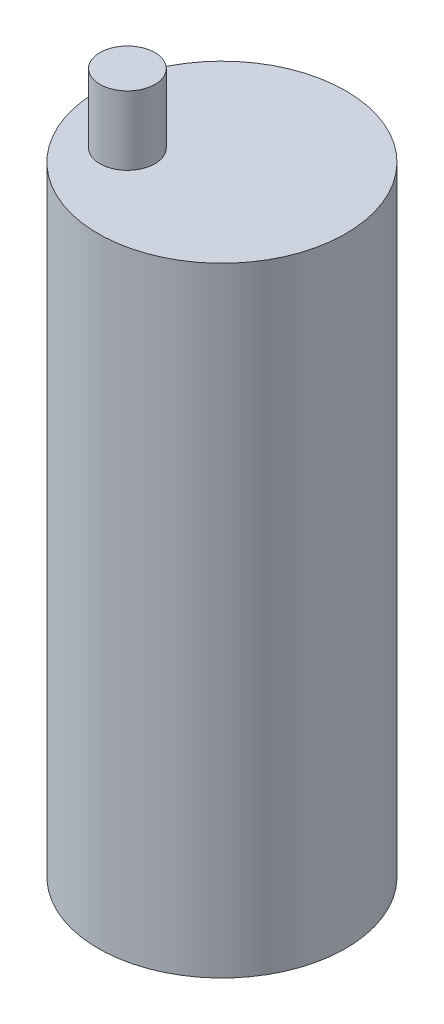
ISO-10303-21;
HEADER;
FILE_DESCRIPTION(('STEP AP214'),'2;1');
FILE_NAME('part.step','',(''),(''),'','','');
FILE_SCHEMA(('AUTOMOTIVE_DESIGN { 1 0 10303 214 1 1 1 1 }'));
ENDSEC;
DATA;
#1=APPLICATION_CONTEXT('core data for automotive mechanical design processes');
#2=APPLICATION_PROTOCOL_DEFINITION('international standard','automotive_design',2000,#1);
#3=PRODUCT_CONTEXT('',#1,'mechanical');
#4=PRODUCT('Part','Part','',(#3));
#5=PRODUCT_RELATED_PRODUCT_CATEGORY('part','',(#4));
#6=PRODUCT_DEFINITION_FORMATION('','',#4);
#7=PRODUCT_DEFINITION_CONTEXT('part definition',#1,'design');
#8=PRODUCT_DEFINITION('design','',#6,#7);
#9=PRODUCT_DEFINITION_SHAPE('','',#8);
#10=(LENGTH_UNIT() NAMED_UNIT(*) SI_UNIT(.MILLI.,.METRE.));
#11=(NAMED_UNIT(*) PLANE_ANGLE_UNIT() SI_UNIT($,.RADIAN.));
#12=(NAMED_UNIT(*) SI_UNIT($,.STERADIAN.) SOLID_ANGLE_UNIT());
#13=UNCERTAINTY_MEASURE_WITH_UNIT(LENGTH_MEASURE(1.E-05),#10,'distance_accuracy_value','');
#14=(GEOMETRIC_REPRESENTATION_CONTEXT(3) GLOBAL_UNCERTAINTY_ASSIGNED_CONTEXT((#13)) GLOBAL_UNIT_ASSIGNED_CONTEXT((#10,
#11,#12)) REPRESENTATION_CONTEXT('',''));
#15=CARTESIAN_POINT('',(0.,0.,0.));
#16=DIRECTION('',(0.,0.,1.));
#17=DIRECTION('',(1.,0.,0.));
#18=AXIS2_PLACEMENT_3D('',#15,#16,#17);
#19=CARTESIAN_POINT('',(0.,45.,0.));
#20=DIRECTION('',(0.,-1.,0.));
#21=DIRECTION('',(0.,0.,-1.));
#22=AXIS2_PLACEMENT_3D('',#19,#20,#21);
#23=CYLINDRICAL_SURFACE('',#22,9.);
#24=CARTESIAN_POINT('',(0.,45.,0.));
#25=DIRECTION('',(0.,1.,0.));
#26=DIRECTION('',(0.,0.,1.));
#27=AXIS2_PLACEMENT_3D('',#24,#25,#26);
#28=CIRCLE('',#27,9.);
#29=CARTESIAN_POINT('',(0.,45.,-9.));
#30=VERTEX_POINT('',#29);
#31=EDGE_CURVE('E10',#30,#30,#28,.T.);
#32=CARTESIAN_POINT('',(0.,0.,0.));
#33=DIRECTION('',(0.,1.,0.));
#34=DIRECTION('',(0.,0.,1.));
#35=AXIS2_PLACEMENT_3D('',#32,#33,#34);
#36=CIRCLE('',#35,9.);
#37=CARTESIAN_POINT('',(0.,0.,-9.));
#38=VERTEX_POINT('',#37);
#39=EDGE_CURVE('E36',#38,#38,#36,.T.);
#40=CARTESIAN_POINT('',(0.,45.,-9.));
#41=CARTESIAN_POINT('',(0.,44.53125,-9.));
#42=CARTESIAN_POINT('',(0.,44.0625,-9.));
#43=CARTESIAN_POINT('',(0.,43.125,-9.));
#44=CARTESIAN_POINT('',(0.,42.65625,-9.));
#45=CARTESIAN_POINT('',(0.,41.71875,-9.));
#46=CARTESIAN_POINT('',(0.,41.25,-9.));
#47=CARTESIAN_POINT('',(0.,40.3125,-9.));
#48=CARTESIAN_POINT('',(0.,39.84375,-9.));
#49=CARTESIAN_POINT('',(0.,38.90625,-9.));
#50=CARTESIAN_POINT('',(0.,38.4375,-9.));
#51=CARTESIAN_POINT('',(0.,37.5,-9.));
#52=CARTESIAN_POINT('',(0.,37.03125,-9.));
#53=CARTESIAN_POINT('',(0.,36.09375,-9.));
#54=CARTESIAN_POINT('',(0.,35.625,-9.));
#55=CARTESIAN_POINT('',(0.,34.6875,-9.));
#56=CARTESIAN_POINT('',(0.,34.21875,-9.));
#57=CARTESIAN_POINT('',(0.,33.28125,-9.));
#58=CARTESIAN_POINT('',(0.,32.8125,-9.));
#59=CARTESIAN_POINT('',(0.,31.875,-9.));
#60=CARTESIAN_POINT('',(0.,31.40625,-9.));
#61=CARTESIAN_POINT('',(0.,30.46875,-9.));
#62=CARTESIAN_POINT('',(0.,30.,-9.));
#63=CARTESIAN_POINT('',(0.,29.0625,-9.));
#64=CARTESIAN_POINT('',(0.,28.59375,-9.));
#65=CARTESIAN_POINT('',(0.,27.65625,-9.));
#66=CARTESIAN_POINT('',(0.,27.1875,-9.));
#67=CARTESIAN_POINT('',(0.,26.25,-9.));
#68=CARTESIAN_POINT('',(0.,25.78125,-9.));
#69=CARTESIAN_POINT('',(0.,24.84375,-9.));
#70=CARTESIAN_POINT('',(0.,24.375,-9.));
#71=CARTESIAN_POINT('',(0.,23.4375,-9.));
#72=CARTESIAN_POINT('',(0.,22.96875,-9.));
#73=CARTESIAN_POINT('',(0.,22.03125,-9.));
#74=CARTESIAN_POINT('',(0.,21.5625,-9.));
#75=CARTESIAN_POINT('',(0.,20.625,-9.));
#76=CARTESIAN_POINT('',(0.,20.15625,-9.));
#77=CARTESIAN_POINT('',(0.,19.21875,-9.));
#78=CARTESIAN_POINT('',(0.,18.75,-9.));
#79=CARTESIAN_POINT('',(0.,17.8125,-9.));
#80=CARTESIAN_POINT('',(0.,17.34375,-9.));
#81=CARTESIAN_POINT('',(0.,16.40625,-9.));
#82=CARTESIAN_POINT('',(0.,15.9375,-9.));
#83=CARTESIAN_POINT('',(0.,15.,-9.));
#84=CARTESIAN_POINT('',(0.,14.53125,-9.));
#85=CARTESIAN_POINT('',(0.,13.59375,-9.));
#86=CARTESIAN_POINT('',(0.,13.125,-9.));
#87=CARTESIAN_POINT('',(0.,12.1875,-9.));
#88=CARTESIAN_POINT('',(0.,11.71875,-9.));
#89=CARTESIAN_POINT('',(0.,10.78125,-9.));
#90=CARTESIAN_POINT('',(0.,10.3125,-9.));
#91=CARTESIAN_POINT('',(0.,9.375,-9.));
#92=CARTESIAN_POINT('',(0.,8.90625,-9.));
#93=CARTESIAN_POINT('',(0.,7.96874999999999,-9.));
#94=CARTESIAN_POINT('',(0.,7.5,-9.));
#95=CARTESIAN_POINT('',(0.,6.5625,-9.));
#96=CARTESIAN_POINT('',(0.,6.09375,-9.));
#97=CARTESIAN_POINT('',(0.,5.15625,-9.));
#98=CARTESIAN_POINT('',(0.,4.68749999999999,-9.));
#99=CARTESIAN_POINT('',(0.,3.74999999999999,-9.));
#100=CARTESIAN_POINT('',(0.,3.28124999999999,-9.));
#101=CARTESIAN_POINT('',(0.,2.34374999999999,-9.));
#102=CARTESIAN_POINT('',(0.,1.87499999999999,-9.));
#103=CARTESIAN_POINT('',(0.,0.937499999999992,-9.));
#104=CARTESIAN_POINT('',(0.,0.468749999999993,-9.));
#105=CARTESIAN_POINT('',(0.,0.,-9.));
#106=B_SPLINE_CURVE_WITH_KNOTS('',3,(#40,#41,#42,#43,#44,#45,#46,#47,#48,#49,#50,#51,#52,#53,
#54,#55,#56,#57,#58,#59,#60,#61,#62,#63,#64,#65,#66,#67,#68,#69,#70,#71,#72,#73,#74,#75,#76,#77,
#78,#79,#80,#81,#82,#83,#84,#85,#86,#87,#88,#89,#90,#91,#92,#93,#94,#95,#96,#97,#98,#99,#100,
#101,#102,#103,#104,#105),.UNSPECIFIED.,.F.,.F.,(4,2,2,2,2,2,2,2,2,2,2,2,2,2,2,2,2,2,2,2,2,2,2,
2,2,2,2,2,2,2,2,2,4),(0.,1.40625,2.8125,4.21875000000001,5.62500000000001,7.03125,8.4375,
9.84375000000001,11.25,12.65625,14.0625,15.46875,16.875,18.28125,19.6875,21.09375,22.5,23.90625,
25.3125,26.71875,28.125,29.53125,30.9375,32.34375,33.75,35.15625,36.5625,37.96875,39.375,
40.78125,42.1875,43.59375,45.),.UNSPECIFIED.);
#107=EDGE_CURVE('BSEAM33',#30,#38,#106,.T.);
#108=ORIENTED_EDGE('',*,*,#31,.F.);
#109=ORIENTED_EDGE('',*,*,#39,.T.);
#110=ORIENTED_EDGE('',*,*,#107,.T.);
#111=ORIENTED_EDGE('',*,*,#107,.F.);
#112=EDGE_LOOP('',(#108,#110,#109,#111));
#113=FACE_BOUND('',#112,.T.);
#114=ADVANCED_FACE('F33',(#113),#23,.T.);
#115=CARTESIAN_POINT('',(0.,45.,0.));
#116=DIRECTION('',(0.,1.,0.));
#117=DIRECTION('',(0.,0.,1.));
#118=AXIS2_PLACEMENT_3D('',#115,#116,#117);
#119=PLANE('',#118);
#120=CARTESIAN_POINT('',(-4.3395800439699,45.,2.53319654694709));
#121=DIRECTION('',(0.,1.,0.));
#122=DIRECTION('',(0.,0.,1.));
#123=AXIS2_PLACEMENT_3D('',#120,#121,#122);
#124=CIRCLE('',#123,2.);
#125=CARTESIAN_POINT('',(-4.3395800439699,45.,4.53319654694709));
#126=VERTEX_POINT('',#125);
#127=EDGE_CURVE('E45',#126,#126,#124,.T.);
#128=ORIENTED_EDGE('',*,*,#127,.F.);
#129=EDGE_LOOP('',(#128));
#130=FACE_BOUND('',#129,.T.);
#131=ORIENTED_EDGE('',*,*,#31,.T.);
#132=EDGE_LOOP('',(#131));
#133=FACE_BOUND('',#132,.T.);
#134=ADVANCED_FACE('F60',(#130,#133),#119,.T.);
#135=CARTESIAN_POINT('',(0.,0.,0.));
#136=DIRECTION('',(0.,1.,0.));
#137=DIRECTION('',(0.,0.,1.));
#138=AXIS2_PLACEMENT_3D('',#135,#136,#137);
#139=PLANE('',#138);
#140=ORIENTED_EDGE('',*,*,#39,.F.);
#141=EDGE_LOOP('',(#140));
#142=FACE_BOUND('',#141,.T.);
#143=ADVANCED_FACE('F56',(#142),#139,.F.);
#144=CARTESIAN_POINT('',(-4.3395800439699,50.,2.53319654694709));
#145=DIRECTION('',(0.,-1.,0.));
#146=DIRECTION('',(0.,0.,-1.));
#147=AXIS2_PLACEMENT_3D('',#144,#145,#146);
#148=CYLINDRICAL_SURFACE('',#147,2.);
#149=CARTESIAN_POINT('',(-4.3395800439699,50.,2.53319654694709));
#150=DIRECTION('',(0.,1.,0.));
#151=DIRECTION('',(0.,0.,1.));
#152=AXIS2_PLACEMENT_3D('',#149,#150,#151);
#153=CIRCLE('',#152,2.);
#154=CARTESIAN_POINT('',(-4.3395800439699,50.,4.53319654694709));
#155=VERTEX_POINT('',#154);
#156=EDGE_CURVE('E43',#155,#155,#153,.T.);
#157=ORIENTED_EDGE('',*,*,#156,.F.);
#158=EDGE_LOOP('',(#157));
#159=FACE_BOUND('',#158,.T.);
#160=ORIENTED_EDGE('',*,*,#127,.T.);
#161=EDGE_LOOP('',(#160));
#162=FACE_BOUND('',#161,.T.);
#163=ADVANCED_FACE('F53',(#159,#162),#148,.T.);
#164=CARTESIAN_POINT('',(-4.3395800439699,50.,2.53319654694709));
#165=DIRECTION('',(0.,1.,0.));
#166=DIRECTION('',(0.,0.,1.));
#167=AXIS2_PLACEMENT_3D('',#164,#165,#166);
#168=PLANE('',#167);
#169=ORIENTED_EDGE('',*,*,#156,.T.);
#170=EDGE_LOOP('',(#169));
#171=FACE_BOUND('',#170,.T.);
#172=ADVANCED_FACE('F51',(#171),#168,.T.);
#173=CLOSED_SHELL('',(#114,#134,#143,#163,#172));
#174=MANIFOLD_SOLID_BREP('B2',#173);
#175=ADVANCED_BREP_SHAPE_REPRESENTATION('',(#18,#174),#14);
#176=SHAPE_DEFINITION_REPRESENTATION(#9,#175);
ENDSEC;
END-ISO-10303-21;
